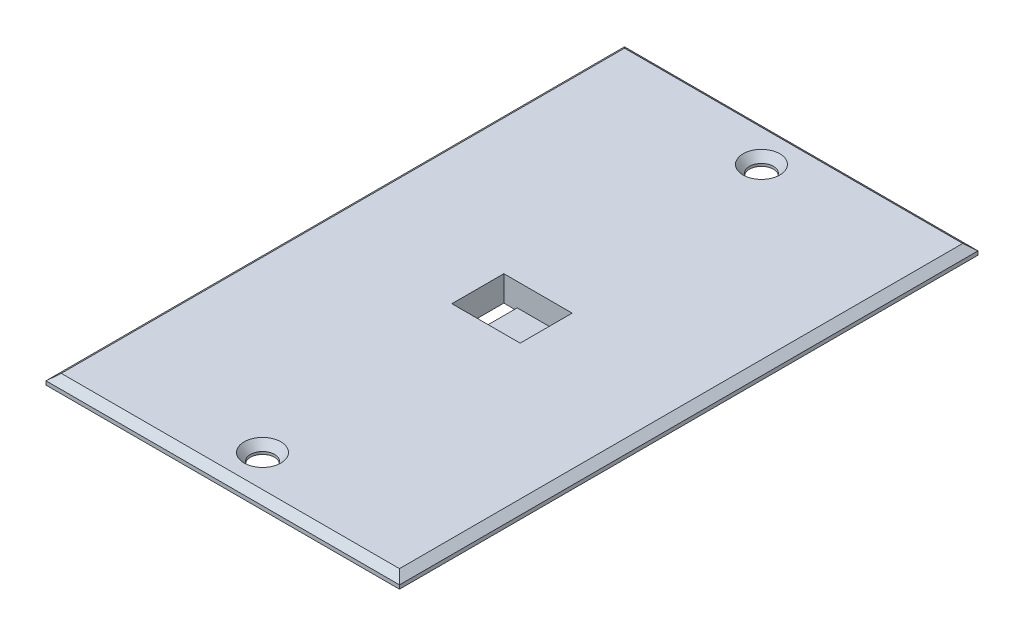
ISO-10303-21;
HEADER;
FILE_DESCRIPTION(('STEP AP214'),'2;1');
FILE_NAME('part.step','',(''),(''),'','','');
FILE_SCHEMA(('AUTOMOTIVE_DESIGN { 1 0 10303 214 1 1 1 1 }'));
ENDSEC;
DATA;
#1=APPLICATION_CONTEXT('core data for automotive mechanical design processes');
#2=APPLICATION_PROTOCOL_DEFINITION('international standard','automotive_design',2000,#1);
#3=PRODUCT_CONTEXT('',#1,'mechanical');
#4=PRODUCT('Part','Part','',(#3));
#5=PRODUCT_RELATED_PRODUCT_CATEGORY('part','',(#4));
#6=PRODUCT_DEFINITION_FORMATION('','',#4);
#7=PRODUCT_DEFINITION_CONTEXT('part definition',#1,'design');
#8=PRODUCT_DEFINITION('design','',#6,#7);
#9=PRODUCT_DEFINITION_SHAPE('','',#8);
#10=(LENGTH_UNIT() NAMED_UNIT(*) SI_UNIT(.MILLI.,.METRE.));
#11=(NAMED_UNIT(*) PLANE_ANGLE_UNIT() SI_UNIT($,.RADIAN.));
#12=(NAMED_UNIT(*) SI_UNIT($,.STERADIAN.) SOLID_ANGLE_UNIT());
#13=UNCERTAINTY_MEASURE_WITH_UNIT(LENGTH_MEASURE(1.E-05),#10,'distance_accuracy_value','');
#14=(GEOMETRIC_REPRESENTATION_CONTEXT(3) GLOBAL_UNCERTAINTY_ASSIGNED_CONTEXT((#13)) GLOBAL_UNIT_ASSIGNED_CONTEXT((#10,
#11,#12)) REPRESENTATION_CONTEXT('',''));
#15=CARTESIAN_POINT('',(0.,0.,0.));
#16=DIRECTION('',(0.,0.,1.));
#17=DIRECTION('',(1.,0.,0.));
#18=AXIS2_PLACEMENT_3D('',#15,#16,#17);
#19=CARTESIAN_POINT('',(6.7,-2.5,-5.1));
#20=DIRECTION('',(1.,0.,0.));
#21=DIRECTION('',(0.,0.,-1.));
#22=AXIS2_PLACEMENT_3D('',#19,#20,#21);
#23=PLANE('',#22);
#24=DIRECTION('',(0.,0.,-1.));
#25=VECTOR('',#24,1.);
#26=CARTESIAN_POINT('',(6.7,2.,-5.1));
#27=LINE('',#26,#25);
#28=CARTESIAN_POINT('',(6.7,2.,5.1));
#29=VERTEX_POINT('',#28);
#30=CARTESIAN_POINT('',(6.7,2.,-5.1));
#31=VERTEX_POINT('',#30);
#32=EDGE_CURVE('E275',#29,#31,#27,.T.);
#33=ORIENTED_EDGE('',*,*,#32,.T.);
#34=DIRECTION('',(0.,1.,0.));
#35=VECTOR('',#34,1.);
#36=CARTESIAN_POINT('',(6.7,-2.5,-5.1));
#37=LINE('',#36,#35);
#38=CARTESIAN_POINT('',(6.7,-2.5,-5.1));
#39=VERTEX_POINT('',#38);
#40=EDGE_CURVE('E302',#39,#31,#37,.T.);
#41=ORIENTED_EDGE('',*,*,#40,.F.);
#42=DIRECTION('',(0.,0.,-1.));
#43=VECTOR('',#42,1.);
#44=CARTESIAN_POINT('',(6.7,-2.5,-5.1));
#45=LINE('',#44,#43);
#46=CARTESIAN_POINT('',(6.7,-2.5,5.1));
#47=VERTEX_POINT('',#46);
#48=EDGE_CURVE('E291',#47,#39,#45,.T.);
#49=ORIENTED_EDGE('',*,*,#48,.F.);
#50=DIRECTION('',(0.,1.,0.));
#51=VECTOR('',#50,1.);
#52=CARTESIAN_POINT('',(6.7,-2.5,5.1));
#53=LINE('',#52,#51);
#54=EDGE_CURVE('E303',#47,#29,#53,.T.);
#55=ORIENTED_EDGE('',*,*,#54,.T.);
#56=EDGE_LOOP('',(#33,#41,#49,#55));
#57=FACE_BOUND('',#56,.T.);
#58=DIRECTION('',(0.,-1.,0.));
#59=VECTOR('',#58,1.);
#60=CARTESIAN_POINT('',(6.7,0.3,-0.637503978051514));
#61=LINE('',#60,#59);
#62=CARTESIAN_POINT('',(6.7,0.96082176619916,-0.637503978051514));
#63=VERTEX_POINT('',#62);
#64=CARTESIAN_POINT('',(6.7,0.299999999999999,-0.637503978051514));
#65=VERTEX_POINT('',#64);
#66=EDGE_CURVE('E225',#63,#65,#61,.T.);
#67=ORIENTED_EDGE('',*,*,#66,.F.);
#68=DIRECTION('',(0.,0.,-1.));
#69=VECTOR('',#68,1.);
#70=CARTESIAN_POINT('',(6.7,0.96082176619916,-0.637503978051514));
#71=LINE('',#70,#69);
#72=CARTESIAN_POINT('',(6.7,0.96082176619916,0.545665972342845));
#73=VERTEX_POINT('',#72);
#74=EDGE_CURVE('E221',#73,#63,#71,.T.);
#75=ORIENTED_EDGE('',*,*,#74,.F.);
#76=DIRECTION('',(0.,1.,0.));
#77=VECTOR('',#76,1.);
#78=CARTESIAN_POINT('',(6.7,0.3,0.545665972342845));
#79=LINE('',#78,#77);
#80=CARTESIAN_POINT('',(6.7,0.3,0.545665972342845));
#81=VERTEX_POINT('',#80);
#82=EDGE_CURVE('E971',#81,#73,#79,.T.);
#83=ORIENTED_EDGE('',*,*,#82,.F.);
#84=DIRECTION('',(0.,0.,1.));
#85=VECTOR('',#84,1.);
#86=CARTESIAN_POINT('',(6.7,0.3,-0.637503978051514));
#87=LINE('',#86,#85);
#88=EDGE_CURVE('E975',#65,#81,#87,.T.);
#89=ORIENTED_EDGE('',*,*,#88,.F.);
#90=EDGE_LOOP('',(#67,#75,#83,#89));
#91=FACE_BOUND('',#90,.T.);
#92=ADVANCED_FACE('F45',(#57,#91),#23,.F.);
#93=CARTESIAN_POINT('',(0.,-2.5,0.));
#94=DIRECTION('',(0.,-1.,0.));
#95=DIRECTION('',(0.,0.,-1.));
#96=AXIS2_PLACEMENT_3D('',#93,#94,#95);
#97=PLANE('',#96);
#98=DIRECTION('',(0.,0.,-1.));
#99=VECTOR('',#98,1.);
#100=CARTESIAN_POINT('',(-4.07864275595177,-2.5,-5.1));
#101=LINE('',#100,#99);
#102=CARTESIAN_POINT('',(-4.07864275595177,-2.5,5.1));
#103=VERTEX_POINT('',#102);
#104=CARTESIAN_POINT('',(-4.07864275595177,-2.5,-5.1));
#105=VERTEX_POINT('',#104);
#106=EDGE_CURVE('E227',#103,#105,#101,.T.);
#107=ORIENTED_EDGE('',*,*,#106,.F.);
#108=DIRECTION('',(1.,0.,0.));
#109=VECTOR('',#108,1.);
#110=CARTESIAN_POINT('',(-6.7,-2.5,5.1));
#111=LINE('',#110,#109);
#112=EDGE_CURVE('E299',#103,#47,#111,.T.);
#113=ORIENTED_EDGE('',*,*,#112,.T.);
#114=ORIENTED_EDGE('',*,*,#48,.T.);
#115=DIRECTION('',(-1.,0.,0.));
#116=VECTOR('',#115,1.);
#117=CARTESIAN_POINT('',(-6.7,-2.5,-5.1));
#118=LINE('',#117,#116);
#119=EDGE_CURVE('E295',#39,#105,#118,.T.);
#120=ORIENTED_EDGE('',*,*,#119,.T.);
#121=EDGE_LOOP('',(#107,#113,#114,#120));
#122=FACE_BOUND('',#121,.T.);
#123=ADVANCED_FACE('F567',(#122),#97,.F.);
#124=CARTESIAN_POINT('',(-34.675,2.,56.75));
#125=DIRECTION('',(0.,0.,-1.));
#126=DIRECTION('',(-1.,0.,0.));
#127=AXIS2_PLACEMENT_3D('',#124,#125,#126);
#128=PLANE('',#127);
#129=DIRECTION('',(0.,-1.,0.));
#130=VECTOR('',#129,1.);
#131=CARTESIAN_POINT('',(34.675,2.,56.75));
#132=LINE('',#131,#130);
#133=CARTESIAN_POINT('',(34.675,0.741350553234083,56.75));
#134=VERTEX_POINT('',#133);
#135=CARTESIAN_POINT('',(34.675,0.,56.75));
#136=VERTEX_POINT('',#135);
#137=EDGE_CURVE('E401',#134,#136,#132,.T.);
#138=ORIENTED_EDGE('',*,*,#137,.F.);
#139=DIRECTION('',(-1.,0.,0.));
#140=VECTOR('',#139,1.);
#141=CARTESIAN_POINT('',(-34.675,0.741350553234083,56.75));
#142=LINE('',#141,#140);
#143=CARTESIAN_POINT('',(-34.675,0.741350553234083,56.75));
#144=VERTEX_POINT('',#143);
#145=EDGE_CURVE('E448',#134,#144,#142,.T.);
#146=ORIENTED_EDGE('',*,*,#145,.T.);
#147=DIRECTION('',(0.,-1.,0.));
#148=VECTOR('',#147,1.);
#149=CARTESIAN_POINT('',(-34.675,2.,56.75));
#150=LINE('',#149,#148);
#151=CARTESIAN_POINT('',(-34.675,0.,56.75));
#152=VERTEX_POINT('',#151);
#153=EDGE_CURVE('E392',#144,#152,#150,.T.);
#154=ORIENTED_EDGE('',*,*,#153,.T.);
#155=DIRECTION('',(1.,0.,0.));
#156=VECTOR('',#155,1.);
#157=CARTESIAN_POINT('',(-34.675,0.,56.75));
#158=LINE('',#157,#156);
#159=EDGE_CURVE('E375',#152,#136,#158,.T.);
#160=ORIENTED_EDGE('',*,*,#159,.T.);
#161=EDGE_LOOP('',(#138,#146,#154,#160));
#162=FACE_BOUND('',#161,.T.);
#163=ADVANCED_FACE('F533',(#162),#128,.F.);
#164=CARTESIAN_POINT('',(34.675,2.,-56.75));
#165=DIRECTION('',(1.,0.,0.));
#166=DIRECTION('',(0.,0.,-1.));
#167=AXIS2_PLACEMENT_3D('',#164,#165,#166);
#168=PLANE('',#167);
#169=DIRECTION('',(0.,-1.,0.));
#170=VECTOR('',#169,1.);
#171=CARTESIAN_POINT('',(34.675,2.,-56.75));
#172=LINE('',#171,#170);
#173=CARTESIAN_POINT('',(34.675,0.741350553234083,-56.75));
#174=VERTEX_POINT('',#173);
#175=CARTESIAN_POINT('',(34.675,0.,-56.75));
#176=VERTEX_POINT('',#175);
#177=EDGE_CURVE('E398',#174,#176,#172,.T.);
#178=ORIENTED_EDGE('',*,*,#177,.F.);
#179=DIRECTION('',(0.,0.,1.));
#180=VECTOR('',#179,1.);
#181=CARTESIAN_POINT('',(34.675,0.741350553234083,56.75));
#182=LINE('',#181,#180);
#183=EDGE_CURVE('E445',#174,#134,#182,.T.);
#184=ORIENTED_EDGE('',*,*,#183,.T.);
#185=ORIENTED_EDGE('',*,*,#137,.T.);
#186=DIRECTION('',(0.,0.,1.));
#187=VECTOR('',#186,1.);
#188=CARTESIAN_POINT('',(34.675,0.,-56.75));
#189=LINE('',#188,#187);
#190=EDGE_CURVE('E379',#176,#136,#189,.T.);
#191=ORIENTED_EDGE('',*,*,#190,.F.);
#192=EDGE_LOOP('',(#178,#184,#185,#191));
#193=FACE_BOUND('',#192,.T.);
#194=ADVANCED_FACE('F559',(#193),#168,.T.);
#195=CARTESIAN_POINT('',(-34.675,2.,-56.75));
#196=DIRECTION('',(0.,0.,-1.));
#197=DIRECTION('',(-1.,0.,0.));
#198=AXIS2_PLACEMENT_3D('',#195,#196,#197);
#199=PLANE('',#198);
#200=DIRECTION('',(0.,-1.,0.));
#201=VECTOR('',#200,1.);
#202=CARTESIAN_POINT('',(-34.675,2.,-56.75));
#203=LINE('',#202,#201);
#204=CARTESIAN_POINT('',(-34.675,0.741350553234083,-56.75));
#205=VERTEX_POINT('',#204);
#206=CARTESIAN_POINT('',(-34.675,0.,-56.75));
#207=VERTEX_POINT('',#206);
#208=EDGE_CURVE('E395',#205,#207,#203,.T.);
#209=ORIENTED_EDGE('',*,*,#208,.F.);
#210=DIRECTION('',(1.,0.,0.));
#211=VECTOR('',#210,1.);
#212=CARTESIAN_POINT('',(34.675,0.741350553234083,-56.75));
#213=LINE('',#212,#211);
#214=EDGE_CURVE('E441',#205,#174,#213,.T.);
#215=ORIENTED_EDGE('',*,*,#214,.T.);
#216=ORIENTED_EDGE('',*,*,#177,.T.);
#217=DIRECTION('',(1.,0.,0.));
#218=VECTOR('',#217,1.);
#219=CARTESIAN_POINT('',(-34.675,0.,-56.75));
#220=LINE('',#219,#218);
#221=EDGE_CURVE('E384',#207,#176,#220,.T.);
#222=ORIENTED_EDGE('',*,*,#221,.F.);
#223=EDGE_LOOP('',(#209,#215,#216,#222));
#224=FACE_BOUND('',#223,.T.);
#225=ADVANCED_FACE('F543',(#224),#199,.T.);
#226=CARTESIAN_POINT('',(-34.675,2.,-56.75));
#227=DIRECTION('',(1.,0.,0.));
#228=DIRECTION('',(0.,0.,-1.));
#229=AXIS2_PLACEMENT_3D('',#226,#227,#228);
#230=PLANE('',#229);
#231=ORIENTED_EDGE('',*,*,#153,.F.);
#232=DIRECTION('',(0.,0.,-1.));
#233=VECTOR('',#232,1.);
#234=CARTESIAN_POINT('',(-34.675,0.741350553234083,-56.75));
#235=LINE('',#234,#233);
#236=EDGE_CURVE('E451',#144,#205,#235,.T.);
#237=ORIENTED_EDGE('',*,*,#236,.T.);
#238=ORIENTED_EDGE('',*,*,#208,.T.);
#239=DIRECTION('',(0.,0.,1.));
#240=VECTOR('',#239,1.);
#241=CARTESIAN_POINT('',(-34.675,0.,-56.75));
#242=LINE('',#241,#240);
#243=EDGE_CURVE('E388',#207,#152,#242,.T.);
#244=ORIENTED_EDGE('',*,*,#243,.T.);
#245=EDGE_LOOP('',(#231,#237,#238,#244));
#246=FACE_BOUND('',#245,.T.);
#247=ADVANCED_FACE('F538',(#246),#230,.F.);
#248=CARTESIAN_POINT('',(0.,2.,0.));
#249=DIRECTION('',(0.,-1.,0.));
#250=DIRECTION('',(0.,0.,-1.));
#251=AXIS2_PLACEMENT_3D('',#248,#249,#250);
#252=PLANE('',#251);
#253=DIRECTION('',(-1.,0.,0.));
#254=VECTOR('',#253,1.);
#255=CARTESIAN_POINT('',(-6.7,2.,-5.1));
#256=LINE('',#255,#254);
#257=CARTESIAN_POINT('',(-6.7,2.,-5.1));
#258=VERTEX_POINT('',#257);
#259=EDGE_CURVE('E279',#31,#258,#256,.T.);
#260=ORIENTED_EDGE('',*,*,#259,.F.);
#261=ORIENTED_EDGE('',*,*,#32,.F.);
#262=DIRECTION('',(1.,0.,0.));
#263=VECTOR('',#262,1.);
#264=CARTESIAN_POINT('',(-6.7,2.,5.1));
#265=LINE('',#264,#263);
#266=CARTESIAN_POINT('',(-6.7,2.,5.1));
#267=VERTEX_POINT('',#266);
#268=EDGE_CURVE('E287',#267,#29,#265,.T.);
#269=ORIENTED_EDGE('',*,*,#268,.F.);
#270=DIRECTION('',(0.,0.,1.));
#271=VECTOR('',#270,1.);
#272=CARTESIAN_POINT('',(-6.7,2.,-5.1));
#273=LINE('',#272,#271);
#274=EDGE_CURVE('E283',#258,#267,#273,.T.);
#275=ORIENTED_EDGE('',*,*,#274,.F.);
#276=EDGE_LOOP('',(#260,#261,#269,#275));
#277=FACE_BOUND('',#276,.T.);
#278=CARTESIAN_POINT('',(0.,2.,48.9430790589483));
#279=DIRECTION('',(0.,-1.,0.));
#280=DIRECTION('',(0.,0.,-1.));
#281=AXIS2_PLACEMENT_3D('',#278,#279,#280);
#282=CIRCLE('',#281,3.60864944676592);
#283=CARTESIAN_POINT('',(0.,2.,45.3344296121823));
#284=VERTEX_POINT('',#283);
#285=EDGE_CURVE('E433',#284,#284,#282,.T.);
#286=ORIENTED_EDGE('',*,*,#285,.T.);
#287=EDGE_LOOP('',(#286));
#288=FACE_BOUND('',#287,.T.);
#289=CARTESIAN_POINT('',(0.,2.,-48.9430790589483));
#290=DIRECTION('',(0.,-1.,0.));
#291=DIRECTION('',(0.,0.,-1.));
#292=AXIS2_PLACEMENT_3D('',#289,#290,#291);
#293=CIRCLE('',#292,3.60864944676592);
#294=CARTESIAN_POINT('',(0.,2.,-52.5517285057142));
#295=VERTEX_POINT('',#294);
#296=EDGE_CURVE('E429',#295,#295,#293,.T.);
#297=ORIENTED_EDGE('',*,*,#296,.T.);
#298=EDGE_LOOP('',(#297));
#299=FACE_BOUND('',#298,.T.);
#300=DIRECTION('',(0.,0.,-1.));
#301=VECTOR('',#300,1.);
#302=CARTESIAN_POINT('',(33.175,2.,-56.75));
#303=LINE('',#302,#301);
#304=CARTESIAN_POINT('',(33.175,2.,55.25));
#305=VERTEX_POINT('',#304);
#306=CARTESIAN_POINT('',(33.175,2.,-55.25));
#307=VERTEX_POINT('',#306);
#308=EDGE_CURVE('E422',#305,#307,#303,.T.);
#309=ORIENTED_EDGE('',*,*,#308,.T.);
#310=DIRECTION('',(-1.,0.,0.));
#311=VECTOR('',#310,1.);
#312=CARTESIAN_POINT('',(-34.675,2.,-55.25));
#313=LINE('',#312,#311);
#314=CARTESIAN_POINT('',(-33.175,2.,-55.25));
#315=VERTEX_POINT('',#314);
#316=EDGE_CURVE('E425',#307,#315,#313,.T.);
#317=ORIENTED_EDGE('',*,*,#316,.T.);
#318=DIRECTION('',(0.,0.,1.));
#319=VECTOR('',#318,1.);
#320=CARTESIAN_POINT('',(-33.175,2.,0.));
#321=LINE('',#320,#319);
#322=CARTESIAN_POINT('',(-33.175,2.,55.25));
#323=VERTEX_POINT('',#322);
#324=EDGE_CURVE('E416',#315,#323,#321,.T.);
#325=ORIENTED_EDGE('',*,*,#324,.T.);
#326=DIRECTION('',(1.,0.,0.));
#327=VECTOR('',#326,1.);
#328=CARTESIAN_POINT('',(0.,2.,55.25));
#329=LINE('',#328,#327);
#330=EDGE_CURVE('E419',#323,#305,#329,.T.);
#331=ORIENTED_EDGE('',*,*,#330,.T.);
#332=EDGE_LOOP('',(#309,#317,#325,#331));
#333=FACE_BOUND('',#332,.T.);
#334=ADVANCED_FACE('F521',(#277,#288,#299,#333),#252,.F.);
#335=CARTESIAN_POINT('',(0.,0.,0.));
#336=DIRECTION('',(0.,-1.,0.));
#337=DIRECTION('',(0.,0.,-1.));
#338=AXIS2_PLACEMENT_3D('',#335,#336,#337);
#339=PLANE('',#338);
#340=DIRECTION('',(0.,0.,-1.));
#341=VECTOR('',#340,1.);
#342=CARTESIAN_POINT('',(-30.1192080439515,0.,-45.2572475035417));
#343=LINE('',#342,#341);
#344=CARTESIAN_POINT('',(-30.1192080439515,0.,45.2572475035417));
#345=VERTEX_POINT('',#344);
#346=CARTESIAN_POINT('',(-30.1192080439515,0.,-45.2572475035417));
#347=VERTEX_POINT('',#346);
#348=EDGE_CURVE('E319',#345,#347,#343,.T.);
#349=ORIENTED_EDGE('',*,*,#348,.F.);
#350=DIRECTION('',(-1.,0.,0.));
#351=VECTOR('',#350,1.);
#352=CARTESIAN_POINT('',(30.1192080439515,0.,45.2572475035417));
#353=LINE('',#352,#351);
#354=CARTESIAN_POINT('',(30.1192080439515,0.,45.2572475035417));
#355=VERTEX_POINT('',#354);
#356=EDGE_CURVE('E336',#355,#345,#353,.T.);
#357=ORIENTED_EDGE('',*,*,#356,.F.);
#358=DIRECTION('',(0.,0.,1.));
#359=VECTOR('',#358,1.);
#360=CARTESIAN_POINT('',(30.1192080439515,0.,-45.2572475035417));
#361=LINE('',#360,#359);
#362=CARTESIAN_POINT('',(30.1192080439515,0.,-45.2572475035417));
#363=VERTEX_POINT('',#362);
#364=EDGE_CURVE('E355',#363,#355,#361,.T.);
#365=ORIENTED_EDGE('',*,*,#364,.F.);
#366=DIRECTION('',(1.,0.,0.));
#367=VECTOR('',#366,1.);
#368=CARTESIAN_POINT('',(30.1192080439515,0.,-45.2572475035417));
#369=LINE('',#368,#367);
#370=EDGE_CURVE('E351',#347,#363,#369,.T.);
#371=ORIENTED_EDGE('',*,*,#370,.F.);
#372=EDGE_LOOP('',(#349,#357,#365,#371));
#373=FACE_BOUND('',#372,.T.);
#374=CARTESIAN_POINT('',(0.,0.,-48.9430790589483));
#375=DIRECTION('',(0.,-1.,0.));
#376=DIRECTION('',(0.,0.,-1.));
#377=AXIS2_PLACEMENT_3D('',#374,#375,#376);
#378=CIRCLE('',#377,2.35);
#379=CARTESIAN_POINT('',(0.,0.,-51.2930790589483));
#380=VERTEX_POINT('',#379);
#381=EDGE_CURVE('E380',#380,#380,#378,.T.);
#382=ORIENTED_EDGE('',*,*,#381,.F.);
#383=EDGE_LOOP('',(#382));
#384=FACE_BOUND('',#383,.T.);
#385=CARTESIAN_POINT('',(0.,0.,48.9430790589483));
#386=DIRECTION('',(0.,-1.,0.));
#387=DIRECTION('',(0.,0.,-1.));
#388=AXIS2_PLACEMENT_3D('',#385,#386,#387);
#389=CIRCLE('',#388,2.35);
#390=CARTESIAN_POINT('',(0.,0.,46.5930790589483));
#391=VERTEX_POINT('',#390);
#392=EDGE_CURVE('E405',#391,#391,#389,.T.);
#393=ORIENTED_EDGE('',*,*,#392,.F.);
#394=EDGE_LOOP('',(#393));
#395=FACE_BOUND('',#394,.T.);
#396=ORIENTED_EDGE('',*,*,#159,.F.);
#397=ORIENTED_EDGE('',*,*,#243,.F.);
#398=ORIENTED_EDGE('',*,*,#221,.T.);
#399=ORIENTED_EDGE('',*,*,#190,.T.);
#400=EDGE_LOOP('',(#396,#397,#398,#399));
#401=FACE_BOUND('',#400,.T.);
#402=ADVANCED_FACE('F517',(#373,#384,#395,#401),#339,.T.);
#403=CARTESIAN_POINT('',(0.,-0.5,48.9430790589483));
#404=DIRECTION('',(0.,1.,0.));
#405=DIRECTION('',(0.,0.,1.));
#406=AXIS2_PLACEMENT_3D('',#403,#404,#405);
#407=CYLINDRICAL_SURFACE('',#406,2.35);
#408=CARTESIAN_POINT('',(0.,0.499999999999986,48.9430790589483));
#409=DIRECTION('',(0.,-1.,0.));
#410=DIRECTION('',(0.,0.,-1.));
#411=AXIS2_PLACEMENT_3D('',#408,#409,#410);
#412=CIRCLE('',#411,2.35);
#413=CARTESIAN_POINT('',(0.,0.499999999999986,46.5930790589483));
#414=VERTEX_POINT('',#413);
#415=EDGE_CURVE('E404',#414,#414,#412,.F.);
#416=ORIENTED_EDGE('',*,*,#415,.T.);
#417=EDGE_LOOP('',(#416));
#418=FACE_BOUND('',#417,.T.);
#419=ORIENTED_EDGE('',*,*,#392,.T.);
#420=EDGE_LOOP('',(#419));
#421=FACE_BOUND('',#420,.T.);
#422=ADVANCED_FACE('F520',(#418,#421),#407,.F.);
#423=CARTESIAN_POINT('',(0.,-0.5,-48.9430790589483));
#424=DIRECTION('',(0.,1.,0.));
#425=DIRECTION('',(0.,0.,1.));
#426=AXIS2_PLACEMENT_3D('',#423,#424,#425);
#427=CYLINDRICAL_SURFACE('',#426,2.35);
#428=CARTESIAN_POINT('',(0.,0.499999999999986,-48.9430790589483));
#429=DIRECTION('',(0.,-1.,0.));
#430=DIRECTION('',(0.,0.,-1.));
#431=AXIS2_PLACEMENT_3D('',#428,#429,#430);
#432=CIRCLE('',#431,2.35);
#433=CARTESIAN_POINT('',(0.,0.499999999999986,-51.2930790589483));
#434=VERTEX_POINT('',#433);
#435=EDGE_CURVE('E437',#434,#434,#432,.F.);
#436=ORIENTED_EDGE('',*,*,#435,.T.);
#437=EDGE_LOOP('',(#436));
#438=FACE_BOUND('',#437,.T.);
#439=ORIENTED_EDGE('',*,*,#381,.T.);
#440=EDGE_LOOP('',(#439));
#441=FACE_BOUND('',#440,.T.);
#442=ADVANCED_FACE('F599',(#438,#441),#427,.F.);
#443=CARTESIAN_POINT('',(0.,0.499999999999986,48.9430790589483));
#444=DIRECTION('',(0.,1.,0.));
#445=DIRECTION('',(0.,0.,1.));
#446=AXIS2_PLACEMENT_3D('',#443,#444,#445);
#447=CONICAL_SURFACE('',#446,2.35,0.698131700797728);
#448=ORIENTED_EDGE('',*,*,#285,.F.);
#449=EDGE_LOOP('',(#448));
#450=FACE_BOUND('',#449,.T.);
#451=ORIENTED_EDGE('',*,*,#415,.F.);
#452=EDGE_LOOP('',(#451));
#453=FACE_BOUND('',#452,.T.);
#454=ADVANCED_FACE('F602',(#450,#453),#447,.F.);
#455=CARTESIAN_POINT('',(0.,0.499999999999986,-48.9430790589483));
#456=DIRECTION('',(0.,1.,0.));
#457=DIRECTION('',(0.,0.,1.));
#458=AXIS2_PLACEMENT_3D('',#455,#456,#457);
#459=CONICAL_SURFACE('',#458,2.35,0.698131700797728);
#460=ORIENTED_EDGE('',*,*,#296,.F.);
#461=EDGE_LOOP('',(#460));
#462=FACE_BOUND('',#461,.T.);
#463=ORIENTED_EDGE('',*,*,#435,.F.);
#464=EDGE_LOOP('',(#463));
#465=FACE_BOUND('',#464,.T.);
#466=ADVANCED_FACE('F641',(#462,#465),#459,.F.);
#467=CARTESIAN_POINT('',(0.,2.,55.25));
#468=DIRECTION('',(0.,-0.766044443118979,-0.642787609686538));
#469=DIRECTION('',(1.,0.,0.));
#470=AXIS2_PLACEMENT_3D('',#467,#468,#469);
#471=PLANE('',#470);
#472=DIRECTION('',(0.608120402411343,-0.510273605374736,0.608120402411343));
#473=VECTOR('',#472,1.);
#474=CARTESIAN_POINT('',(20.9065391894751,12.2944609412243,42.9815391894751));
#475=LINE('',#474,#473);
#476=EDGE_CURVE('E460',#305,#134,#475,.T.);
#477=ORIENTED_EDGE('',*,*,#476,.F.);
#478=ORIENTED_EDGE('',*,*,#330,.F.);
#479=DIRECTION('',(0.608120402411343,0.510273605374736,-0.608120402411344));
#480=VECTOR('',#479,1.);
#481=CARTESIAN_POINT('',(-12.7429740834514,19.1445054107805,34.8179740834514));
#482=LINE('',#481,#480);
#483=EDGE_CURVE('E409',#144,#323,#482,.T.);
#484=ORIENTED_EDGE('',*,*,#483,.F.);
#485=ORIENTED_EDGE('',*,*,#145,.F.);
#486=EDGE_LOOP('',(#477,#478,#484,#485));
#487=FACE_BOUND('',#486,.T.);
#488=ADVANCED_FACE('F649',(#487),#471,.F.);
#489=CARTESIAN_POINT('',(-33.175,2.,0.));
#490=DIRECTION('',(0.642787609686538,-0.766044443118979,0.));
#491=DIRECTION('',(0.,0.,1.));
#492=AXIS2_PLACEMENT_3D('',#489,#490,#491);
#493=PLANE('',#492);
#494=ORIENTED_EDGE('',*,*,#483,.T.);
#495=ORIENTED_EDGE('',*,*,#324,.F.);
#496=DIRECTION('',(0.608120402411343,0.510273605374736,0.608120402411343));
#497=VECTOR('',#496,1.);
#498=CARTESIAN_POINT('',(-12.7429740834514,19.1445054107805,-34.8179740834514));
#499=LINE('',#498,#497);
#500=EDGE_CURVE('E457',#205,#315,#499,.T.);
#501=ORIENTED_EDGE('',*,*,#500,.F.);
#502=ORIENTED_EDGE('',*,*,#236,.F.);
#503=EDGE_LOOP('',(#494,#495,#501,#502));
#504=FACE_BOUND('',#503,.T.);
#505=ADVANCED_FACE('F548',(#504),#493,.F.);
#506=CARTESIAN_POINT('',(34.675,0.741350553234083,-56.75));
#507=DIRECTION('',(0.642787609686538,0.766044443118979,0.));
#508=DIRECTION('',(0.,0.,-1.));
#509=AXIS2_PLACEMENT_3D('',#506,#507,#508);
#510=PLANE('',#509);
#511=ORIENTED_EDGE('',*,*,#476,.T.);
#512=ORIENTED_EDGE('',*,*,#183,.F.);
#513=DIRECTION('',(-0.608120402411343,0.510273605374736,0.608120402411344));
#514=VECTOR('',#513,1.);
#515=CARTESIAN_POINT('',(34.675,0.741350553234083,-56.75));
#516=LINE('',#515,#514);
#517=EDGE_CURVE('E365',#307,#174,#516,.F.);
#518=ORIENTED_EDGE('',*,*,#517,.F.);
#519=ORIENTED_EDGE('',*,*,#308,.F.);
#520=EDGE_LOOP('',(#511,#512,#518,#519));
#521=FACE_BOUND('',#520,.T.);
#522=ADVANCED_FACE('F556',(#521),#510,.T.);
#523=CARTESIAN_POINT('',(-34.675,0.741350553234083,-56.75));
#524=DIRECTION('',(0.,0.766044443118979,-0.642787609686538));
#525=DIRECTION('',(-1.,0.,0.));
#526=AXIS2_PLACEMENT_3D('',#523,#524,#525);
#527=PLANE('',#526);
#528=ORIENTED_EDGE('',*,*,#500,.T.);
#529=ORIENTED_EDGE('',*,*,#316,.F.);
#530=ORIENTED_EDGE('',*,*,#517,.T.);
#531=ORIENTED_EDGE('',*,*,#214,.F.);
#532=EDGE_LOOP('',(#528,#529,#530,#531));
#533=FACE_BOUND('',#532,.T.);
#534=ADVANCED_FACE('F551',(#533),#527,.T.);
#535=CARTESIAN_POINT('',(-30.1192080439515,1.5,-45.2572475035417));
#536=DIRECTION('',(-1.,0.,0.));
#537=DIRECTION('',(0.,0.,1.));
#538=AXIS2_PLACEMENT_3D('',#535,#536,#537);
#539=PLANE('',#538);
#540=ORIENTED_EDGE('',*,*,#348,.T.);
#541=DIRECTION('',(0.,-1.,0.));
#542=VECTOR('',#541,1.);
#543=CARTESIAN_POINT('',(-30.1192080439515,1.5,-45.2572475035417));
#544=LINE('',#543,#542);
#545=CARTESIAN_POINT('',(-30.1192080439515,1.5,-45.2572475035417));
#546=VERTEX_POINT('',#545);
#547=EDGE_CURVE('E348',#546,#347,#544,.T.);
#548=ORIENTED_EDGE('',*,*,#547,.F.);
#549=DIRECTION('',(0.,0.,-1.));
#550=VECTOR('',#549,1.);
#551=CARTESIAN_POINT('',(-30.1192080439515,1.5,-45.2572475035417));
#552=LINE('',#551,#550);
#553=CARTESIAN_POINT('',(-30.1192080439515,1.5,45.2572475035417));
#554=VERTEX_POINT('',#553);
#555=EDGE_CURVE('E331',#554,#546,#552,.T.);
#556=ORIENTED_EDGE('',*,*,#555,.F.);
#557=DIRECTION('',(0.,-1.,0.));
#558=VECTOR('',#557,1.);
#559=CARTESIAN_POINT('',(-30.1192080439515,1.5,45.2572475035417));
#560=LINE('',#559,#558);
#561=EDGE_CURVE('E362',#554,#345,#560,.T.);
#562=ORIENTED_EDGE('',*,*,#561,.T.);
#563=EDGE_LOOP('',(#540,#548,#556,#562));
#564=FACE_BOUND('',#563,.T.);
#565=ADVANCED_FACE('F505',(#564),#539,.F.);
#566=CARTESIAN_POINT('',(30.1192080439515,1.5,45.2572475035417));
#567=DIRECTION('',(0.,0.,1.));
#568=DIRECTION('',(1.,0.,0.));
#569=AXIS2_PLACEMENT_3D('',#566,#567,#568);
#570=PLANE('',#569);
#571=ORIENTED_EDGE('',*,*,#356,.T.);
#572=ORIENTED_EDGE('',*,*,#561,.F.);
#573=DIRECTION('',(-1.,0.,0.));
#574=VECTOR('',#573,1.);
#575=CARTESIAN_POINT('',(30.1192080439515,1.5,45.2572475035417));
#576=LINE('',#575,#574);
#577=CARTESIAN_POINT('',(30.1192080439515,1.5,45.2572475035417));
#578=VERTEX_POINT('',#577);
#579=EDGE_CURVE('E344',#578,#554,#576,.T.);
#580=ORIENTED_EDGE('',*,*,#579,.F.);
#581=DIRECTION('',(0.,-1.,0.));
#582=VECTOR('',#581,1.);
#583=CARTESIAN_POINT('',(30.1192080439515,1.5,45.2572475035417));
#584=LINE('',#583,#582);
#585=EDGE_CURVE('E366',#578,#355,#584,.T.);
#586=ORIENTED_EDGE('',*,*,#585,.T.);
#587=EDGE_LOOP('',(#571,#572,#580,#586));
#588=FACE_BOUND('',#587,.T.);
#589=ADVANCED_FACE('F514',(#588),#570,.F.);
#590=CARTESIAN_POINT('',(30.1192080439515,1.5,-45.2572475035417));
#591=DIRECTION('',(1.,0.,0.));
#592=DIRECTION('',(0.,0.,-1.));
#593=AXIS2_PLACEMENT_3D('',#590,#591,#592);
#594=PLANE('',#593);
#595=ORIENTED_EDGE('',*,*,#364,.T.);
#596=ORIENTED_EDGE('',*,*,#585,.F.);
#597=DIRECTION('',(0.,0.,1.));
#598=VECTOR('',#597,1.);
#599=CARTESIAN_POINT('',(30.1192080439515,1.5,-45.2572475035417));
#600=LINE('',#599,#598);
#601=CARTESIAN_POINT('',(30.1192080439515,1.5,-45.2572475035417));
#602=VERTEX_POINT('',#601);
#603=EDGE_CURVE('E340',#602,#578,#600,.T.);
#604=ORIENTED_EDGE('',*,*,#603,.F.);
#605=DIRECTION('',(0.,-1.,0.));
#606=VECTOR('',#605,1.);
#607=CARTESIAN_POINT('',(30.1192080439515,1.5,-45.2572475035417));
#608=LINE('',#607,#606);
#609=EDGE_CURVE('E369',#602,#363,#608,.T.);
#610=ORIENTED_EDGE('',*,*,#609,.T.);
#611=EDGE_LOOP('',(#595,#596,#604,#610));
#612=FACE_BOUND('',#611,.T.);
#613=ADVANCED_FACE('F512',(#612),#594,.F.);
#614=CARTESIAN_POINT('',(30.1192080439515,1.5,-45.2572475035417));
#615=DIRECTION('',(0.,0.,-1.));
#616=DIRECTION('',(-1.,0.,0.));
#617=AXIS2_PLACEMENT_3D('',#614,#615,#616);
#618=PLANE('',#617);
#619=ORIENTED_EDGE('',*,*,#370,.T.);
#620=ORIENTED_EDGE('',*,*,#609,.F.);
#621=DIRECTION('',(1.,0.,0.));
#622=VECTOR('',#621,1.);
#623=CARTESIAN_POINT('',(30.1192080439515,1.5,-45.2572475035417));
#624=LINE('',#623,#622);
#625=EDGE_CURVE('E335',#546,#602,#624,.T.);
#626=ORIENTED_EDGE('',*,*,#625,.F.);
#627=ORIENTED_EDGE('',*,*,#547,.T.);
#628=EDGE_LOOP('',(#619,#620,#626,#627));
#629=FACE_BOUND('',#628,.T.);
#630=ADVANCED_FACE('F499',(#629),#618,.F.);
#631=CARTESIAN_POINT('',(0.,1.5,0.));
#632=DIRECTION('',(0.,-1.,0.));
#633=DIRECTION('',(0.,0.,-1.));
#634=AXIS2_PLACEMENT_3D('',#631,#632,#633);
#635=PLANE('',#634);
#636=DIRECTION('',(0.,0.,-1.));
#637=VECTOR('',#636,1.);
#638=CARTESIAN_POINT('',(-10.4666275698357,1.5,0.));
#639=LINE('',#638,#637);
#640=CARTESIAN_POINT('',(-10.4666275698357,1.5,8.54946269997599));
#641=VERTEX_POINT('',#640);
#642=CARTESIAN_POINT('',(-10.4666275698357,1.5,-8.54946269997599));
#643=VERTEX_POINT('',#642);
#644=EDGE_CURVE('E208',#641,#643,#639,.T.);
#645=ORIENTED_EDGE('',*,*,#644,.F.);
#646=DIRECTION('',(-1.,0.,0.));
#647=VECTOR('',#646,1.);
#648=CARTESIAN_POINT('',(0.,1.5,8.54946269997599));
#649=LINE('',#648,#647);
#650=CARTESIAN_POINT('',(10.4666275698356,1.5,8.54946269997599));
#651=VERTEX_POINT('',#650);
#652=EDGE_CURVE('E454',#651,#641,#649,.T.);
#653=ORIENTED_EDGE('',*,*,#652,.F.);
#654=DIRECTION('',(0.,0.,1.));
#655=VECTOR('',#654,1.);
#656=CARTESIAN_POINT('',(10.4666275698356,1.5,0.));
#657=LINE('',#656,#655);
#658=CARTESIAN_POINT('',(10.4666275698356,1.5,-8.54946269997599));
#659=VERTEX_POINT('',#658);
#660=EDGE_CURVE('E470',#659,#651,#657,.T.);
#661=ORIENTED_EDGE('',*,*,#660,.F.);
#662=DIRECTION('',(1.,0.,0.));
#663=VECTOR('',#662,1.);
#664=CARTESIAN_POINT('',(0.,1.5,-8.54946269997599));
#665=LINE('',#664,#663);
#666=EDGE_CURVE('E474',#643,#659,#665,.T.);
#667=ORIENTED_EDGE('',*,*,#666,.F.);
#668=EDGE_LOOP('',(#645,#653,#661,#667));
#669=FACE_BOUND('',#668,.T.);
#670=ORIENTED_EDGE('',*,*,#555,.T.);
#671=ORIENTED_EDGE('',*,*,#625,.T.);
#672=ORIENTED_EDGE('',*,*,#603,.T.);
#673=ORIENTED_EDGE('',*,*,#579,.T.);
#674=EDGE_LOOP('',(#670,#671,#672,#673));
#675=FACE_BOUND('',#674,.T.);
#676=ADVANCED_FACE('F496',(#669,#675),#635,.T.);
#677=CARTESIAN_POINT('',(-10.4666275698357,-2.5,-8.54946269997599));
#678=DIRECTION('',(-1.,0.,0.));
#679=DIRECTION('',(0.,0.,1.));
#680=AXIS2_PLACEMENT_3D('',#677,#678,#679);
#681=PLANE('',#680);
#682=DIRECTION('',(0.,1.,0.));
#683=VECTOR('',#682,1.);
#684=CARTESIAN_POINT('',(-10.4666275698357,-2.5,8.54946269997599));
#685=LINE('',#684,#683);
#686=CARTESIAN_POINT('',(-10.4666275698356,-3.,8.54946269997599));
#687=VERTEX_POINT('',#686);
#688=EDGE_CURVE('E306',#687,#641,#685,.T.);
#689=ORIENTED_EDGE('',*,*,#688,.T.);
#690=ORIENTED_EDGE('',*,*,#644,.T.);
#691=DIRECTION('',(0.,1.,0.));
#692=VECTOR('',#691,1.);
#693=CARTESIAN_POINT('',(-10.4666275698357,-2.5,-8.54946269997599));
#694=LINE('',#693,#692);
#695=CARTESIAN_POINT('',(-10.4666275698356,-3.,-8.54946269997599));
#696=VERTEX_POINT('',#695);
#697=EDGE_CURVE('E315',#696,#643,#694,.T.);
#698=ORIENTED_EDGE('',*,*,#697,.F.);
#699=DIRECTION('',(0.,0.,-1.));
#700=VECTOR('',#699,1.);
#701=CARTESIAN_POINT('',(-10.4666275698356,-3.,8.54946269997599));
#702=LINE('',#701,#700);
#703=EDGE_CURVE('E267',#687,#696,#702,.T.);
#704=ORIENTED_EDGE('',*,*,#703,.F.);
#705=EDGE_LOOP('',(#689,#690,#698,#704));
#706=FACE_BOUND('',#705,.T.);
#707=ADVANCED_FACE('F482',(#706),#681,.T.);
#708=CARTESIAN_POINT('',(10.4666275698356,-2.5,-8.54946269997599));
#709=DIRECTION('',(0.,0.,-1.));
#710=DIRECTION('',(-1.,0.,0.));
#711=AXIS2_PLACEMENT_3D('',#708,#709,#710);
#712=PLANE('',#711);
#713=ORIENTED_EDGE('',*,*,#697,.T.);
#714=ORIENTED_EDGE('',*,*,#666,.T.);
#715=DIRECTION('',(0.,1.,0.));
#716=VECTOR('',#715,1.);
#717=CARTESIAN_POINT('',(10.4666275698356,-2.5,-8.54946269997599));
#718=LINE('',#717,#716);
#719=CARTESIAN_POINT('',(10.4666275698356,-3.,-8.54946269997599));
#720=VERTEX_POINT('',#719);
#721=EDGE_CURVE('E320',#720,#659,#718,.T.);
#722=ORIENTED_EDGE('',*,*,#721,.F.);
#723=DIRECTION('',(1.,0.,0.));
#724=VECTOR('',#723,1.);
#725=CARTESIAN_POINT('',(-10.4666275698356,-3.,-8.54946269997599));
#726=LINE('',#725,#724);
#727=EDGE_CURVE('E271',#696,#720,#726,.T.);
#728=ORIENTED_EDGE('',*,*,#727,.F.);
#729=EDGE_LOOP('',(#713,#714,#722,#728));
#730=FACE_BOUND('',#729,.T.);
#731=ADVANCED_FACE('F487',(#730),#712,.T.);
#732=CARTESIAN_POINT('',(10.4666275698356,-2.5,-8.54946269997599));
#733=DIRECTION('',(1.,0.,0.));
#734=DIRECTION('',(0.,0.,-1.));
#735=AXIS2_PLACEMENT_3D('',#732,#733,#734);
#736=PLANE('',#735);
#737=ORIENTED_EDGE('',*,*,#721,.T.);
#738=ORIENTED_EDGE('',*,*,#660,.T.);
#739=DIRECTION('',(0.,1.,0.));
#740=VECTOR('',#739,1.);
#741=CARTESIAN_POINT('',(10.4666275698356,-2.5,8.54946269997599));
#742=LINE('',#741,#740);
#743=CARTESIAN_POINT('',(10.4666275698356,-3.,8.54946269997599));
#744=VERTEX_POINT('',#743);
#745=EDGE_CURVE('E324',#744,#651,#742,.T.);
#746=ORIENTED_EDGE('',*,*,#745,.F.);
#747=DIRECTION('',(0.,0.,1.));
#748=VECTOR('',#747,1.);
#749=CARTESIAN_POINT('',(10.4666275698356,-3.,8.54946269997599));
#750=LINE('',#749,#748);
#751=EDGE_CURVE('E257',#720,#744,#750,.T.);
#752=ORIENTED_EDGE('',*,*,#751,.F.);
#753=EDGE_LOOP('',(#737,#738,#746,#752));
#754=FACE_BOUND('',#753,.T.);
#755=ADVANCED_FACE('F492',(#754),#736,.T.);
#756=CARTESIAN_POINT('',(10.4666275698356,-2.5,8.54946269997599));
#757=DIRECTION('',(0.,0.,1.));
#758=DIRECTION('',(1.,0.,0.));
#759=AXIS2_PLACEMENT_3D('',#756,#757,#758);
#760=PLANE('',#759);
#761=ORIENTED_EDGE('',*,*,#745,.T.);
#762=ORIENTED_EDGE('',*,*,#652,.T.);
#763=ORIENTED_EDGE('',*,*,#688,.F.);
#764=DIRECTION('',(-1.,0.,0.));
#765=VECTOR('',#764,1.);
#766=CARTESIAN_POINT('',(-10.4666275698356,-3.,8.54946269997599));
#767=LINE('',#766,#765);
#768=EDGE_CURVE('E263',#744,#687,#767,.T.);
#769=ORIENTED_EDGE('',*,*,#768,.F.);
#770=EDGE_LOOP('',(#761,#762,#763,#769));
#771=FACE_BOUND('',#770,.T.);
#772=ADVANCED_FACE('F495',(#771),#760,.T.);
#773=CARTESIAN_POINT('',(-6.7,-2.5,5.1));
#774=DIRECTION('',(0.,0.,1.));
#775=DIRECTION('',(1.,0.,0.));
#776=AXIS2_PLACEMENT_3D('',#773,#774,#775);
#777=PLANE('',#776);
#778=ORIENTED_EDGE('',*,*,#268,.T.);
#779=ORIENTED_EDGE('',*,*,#54,.F.);
#780=ORIENTED_EDGE('',*,*,#112,.F.);
#781=DIRECTION('',(0.,1.,0.));
#782=VECTOR('',#781,1.);
#783=CARTESIAN_POINT('',(-4.07864275595177,-3.,5.1));
#784=LINE('',#783,#782);
#785=CARTESIAN_POINT('',(-4.07864275595177,-3.,5.1));
#786=VERTEX_POINT('',#785);
#787=EDGE_CURVE('E252',#786,#103,#784,.T.);
#788=ORIENTED_EDGE('',*,*,#787,.F.);
#789=DIRECTION('',(1.,0.,0.));
#790=VECTOR('',#789,1.);
#791=CARTESIAN_POINT('',(-6.7,-3.,5.1));
#792=LINE('',#791,#790);
#793=CARTESIAN_POINT('',(-6.7,-3.,5.1));
#794=VERTEX_POINT('',#793);
#795=EDGE_CURVE('E241',#794,#786,#792,.T.);
#796=ORIENTED_EDGE('',*,*,#795,.F.);
#797=DIRECTION('',(0.,1.,0.));
#798=VECTOR('',#797,1.);
#799=CARTESIAN_POINT('',(-6.7,-2.5,5.1));
#800=LINE('',#799,#798);
#801=EDGE_CURVE('E307',#794,#267,#800,.T.);
#802=ORIENTED_EDGE('',*,*,#801,.T.);
#803=EDGE_LOOP('',(#778,#779,#780,#788,#796,#802));
#804=FACE_BOUND('',#803,.T.);
#805=ADVANCED_FACE('F588',(#804),#777,.F.);
#806=CARTESIAN_POINT('',(-6.7,-2.5,-5.1));
#807=DIRECTION('',(-1.,0.,0.));
#808=DIRECTION('',(0.,0.,1.));
#809=AXIS2_PLACEMENT_3D('',#806,#807,#808);
#810=PLANE('',#809);
#811=ORIENTED_EDGE('',*,*,#274,.T.);
#812=ORIENTED_EDGE('',*,*,#801,.F.);
#813=DIRECTION('',(0.,0.,1.));
#814=VECTOR('',#813,1.);
#815=CARTESIAN_POINT('',(-6.7,-3.,-5.1));
#816=LINE('',#815,#814);
#817=CARTESIAN_POINT('',(-6.7,-3.,-5.1));
#818=VERTEX_POINT('',#817);
#819=EDGE_CURVE('E232',#818,#794,#816,.T.);
#820=ORIENTED_EDGE('',*,*,#819,.F.);
#821=DIRECTION('',(0.,1.,0.));
#822=VECTOR('',#821,1.);
#823=CARTESIAN_POINT('',(-6.7,-2.5,-5.1));
#824=LINE('',#823,#822);
#825=EDGE_CURVE('E310',#818,#258,#824,.T.);
#826=ORIENTED_EDGE('',*,*,#825,.T.);
#827=EDGE_LOOP('',(#811,#812,#820,#826));
#828=FACE_BOUND('',#827,.T.);
#829=ADVANCED_FACE('F714',(#828),#810,.F.);
#830=CARTESIAN_POINT('',(-6.7,-2.5,-5.1));
#831=DIRECTION('',(0.,0.,-1.));
#832=DIRECTION('',(-1.,0.,0.));
#833=AXIS2_PLACEMENT_3D('',#830,#831,#832);
#834=PLANE('',#833);
#835=ORIENTED_EDGE('',*,*,#259,.T.);
#836=ORIENTED_EDGE('',*,*,#825,.F.);
#837=DIRECTION('',(-1.,0.,0.));
#838=VECTOR('',#837,1.);
#839=CARTESIAN_POINT('',(-6.7,-3.,-5.1));
#840=LINE('',#839,#838);
#841=CARTESIAN_POINT('',(-4.07864275595177,-3.,-5.1));
#842=VERTEX_POINT('',#841);
#843=EDGE_CURVE('E249',#842,#818,#840,.T.);
#844=ORIENTED_EDGE('',*,*,#843,.F.);
#845=DIRECTION('',(0.,1.,0.));
#846=VECTOR('',#845,1.);
#847=CARTESIAN_POINT('',(-4.07864275595177,-3.,-5.1));
#848=LINE('',#847,#846);
#849=EDGE_CURVE('E254',#842,#105,#848,.T.);
#850=ORIENTED_EDGE('',*,*,#849,.T.);
#851=ORIENTED_EDGE('',*,*,#119,.F.);
#852=ORIENTED_EDGE('',*,*,#40,.T.);
#853=EDGE_LOOP('',(#835,#836,#844,#850,#851,#852));
#854=FACE_BOUND('',#853,.T.);
#855=ADVANCED_FACE('F580',(#854),#834,.F.);
#856=CARTESIAN_POINT('',(0.,-3.,0.));
#857=DIRECTION('',(0.,-1.,0.));
#858=DIRECTION('',(0.,0.,-1.));
#859=AXIS2_PLACEMENT_3D('',#856,#857,#858);
#860=PLANE('',#859);
#861=ORIENTED_EDGE('',*,*,#819,.T.);
#862=ORIENTED_EDGE('',*,*,#795,.T.);
#863=DIRECTION('',(0.,0.,-1.));
#864=VECTOR('',#863,1.);
#865=CARTESIAN_POINT('',(-4.07864275595177,-3.,-5.1));
#866=LINE('',#865,#864);
#867=EDGE_CURVE('E245',#786,#842,#866,.T.);
#868=ORIENTED_EDGE('',*,*,#867,.T.);
#869=ORIENTED_EDGE('',*,*,#843,.T.);
#870=EDGE_LOOP('',(#861,#862,#868,#869));
#871=FACE_BOUND('',#870,.T.);
#872=ORIENTED_EDGE('',*,*,#751,.T.);
#873=ORIENTED_EDGE('',*,*,#768,.T.);
#874=ORIENTED_EDGE('',*,*,#703,.T.);
#875=ORIENTED_EDGE('',*,*,#727,.T.);
#876=EDGE_LOOP('',(#872,#873,#874,#875));
#877=FACE_BOUND('',#876,.T.);
#878=ADVANCED_FACE('F490',(#871,#877),#860,.T.);
#879=CARTESIAN_POINT('',(-4.07864275595177,-3.,-5.1));
#880=DIRECTION('',(1.,0.,0.));
#881=DIRECTION('',(0.,0.,-1.));
#882=AXIS2_PLACEMENT_3D('',#879,#880,#881);
#883=PLANE('',#882);
#884=ORIENTED_EDGE('',*,*,#106,.T.);
#885=ORIENTED_EDGE('',*,*,#849,.F.);
#886=ORIENTED_EDGE('',*,*,#867,.F.);
#887=ORIENTED_EDGE('',*,*,#787,.T.);
#888=EDGE_LOOP('',(#884,#885,#886,#887));
#889=FACE_BOUND('',#888,.T.);
#890=ADVANCED_FACE('F734',(#889),#883,.F.);
#891=CARTESIAN_POINT('',(5.7,0.3,-0.637503978051513));
#892=DIRECTION('',(0.,0.,1.));
#893=DIRECTION('',(1.,0.,0.));
#894=AXIS2_PLACEMENT_3D('',#891,#892,#893);
#895=PLANE('',#894);
#896=DIRECTION('',(1.,0.,0.));
#897=VECTOR('',#896,1.);
#898=CARTESIAN_POINT('',(5.7,0.3,-0.637503978051513));
#899=LINE('',#898,#897);
#900=CARTESIAN_POINT('',(5.7,0.3,-0.637503978051513));
#901=VERTEX_POINT('',#900);
#902=EDGE_CURVE('E215',#901,#65,#899,.T.);
#903=ORIENTED_EDGE('',*,*,#902,.F.);
#904=CARTESIAN_POINT('',(6.56763688976202,0.0608217661991603,-0.637503978051513));
#905=DIRECTION('',(0.,0.,1.));
#906=DIRECTION('',(1.,0.,0.));
#907=AXIS2_PLACEMENT_3D('',#904,#905,#906);
#908=CIRCLE('',#907,0.9);
#909=CARTESIAN_POINT('',(6.56763688976202,0.96082176619916,-0.637503978051513));
#910=VERTEX_POINT('',#909);
#911=EDGE_CURVE('E68',#901,#910,#908,.F.);
#912=ORIENTED_EDGE('',*,*,#911,.T.);
#913=DIRECTION('',(1.,0.,0.));
#914=VECTOR('',#913,1.);
#915=CARTESIAN_POINT('',(5.7,0.96082176619916,-0.637503978051513));
#916=LINE('',#915,#914);
#917=EDGE_CURVE('E220',#910,#63,#916,.T.);
#918=ORIENTED_EDGE('',*,*,#917,.T.);
#919=ORIENTED_EDGE('',*,*,#66,.T.);
#920=EDGE_LOOP('',(#903,#912,#918,#919));
#921=FACE_BOUND('',#920,.T.);
#922=ADVANCED_FACE('F223',(#921),#895,.F.);
#923=CARTESIAN_POINT('',(5.7,0.3,-0.637503978051513));
#924=DIRECTION('',(0.,1.,0.));
#925=DIRECTION('',(0.,0.,1.));
#926=AXIS2_PLACEMENT_3D('',#923,#924,#925);
#927=PLANE('',#926);
#928=ORIENTED_EDGE('',*,*,#88,.T.);
#929=DIRECTION('',(1.,0.,0.));
#930=VECTOR('',#929,1.);
#931=CARTESIAN_POINT('',(5.7,0.3,0.545665972342845));
#932=LINE('',#931,#930);
#933=CARTESIAN_POINT('',(5.7,0.3,0.545665972342845));
#934=VERTEX_POINT('',#933);
#935=EDGE_CURVE('E218',#934,#81,#932,.T.);
#936=ORIENTED_EDGE('',*,*,#935,.F.);
#937=DIRECTION('',(0.,0.,1.));
#938=VECTOR('',#937,1.);
#939=CARTESIAN_POINT('',(5.7,0.3,-0.637503978051513));
#940=LINE('',#939,#938);
#941=EDGE_CURVE('E206',#901,#934,#940,.T.);
#942=ORIENTED_EDGE('',*,*,#941,.F.);
#943=ORIENTED_EDGE('',*,*,#902,.T.);
#944=EDGE_LOOP('',(#928,#936,#942,#943));
#945=FACE_BOUND('',#944,.T.);
#946=ADVANCED_FACE('F214',(#945),#927,.F.);
#947=CARTESIAN_POINT('',(5.7,0.3,0.545665972342845));
#948=DIRECTION('',(0.,0.,-1.));
#949=DIRECTION('',(-1.,0.,0.));
#950=AXIS2_PLACEMENT_3D('',#947,#948,#949);
#951=PLANE('',#950);
#952=DIRECTION('',(1.,0.,0.));
#953=VECTOR('',#952,1.);
#954=CARTESIAN_POINT('',(5.7,0.96082176619916,0.545665972342845));
#955=LINE('',#954,#953);
#956=CARTESIAN_POINT('',(6.56763688976202,0.96082176619916,0.545665972342845));
#957=VERTEX_POINT('',#956);
#958=EDGE_CURVE('E234',#957,#73,#955,.T.);
#959=ORIENTED_EDGE('',*,*,#958,.F.);
#960=CARTESIAN_POINT('',(6.56763688976202,0.0608217661991603,0.545665972342845));
#961=DIRECTION('',(0.,0.,-1.));
#962=DIRECTION('',(-1.,0.,0.));
#963=AXIS2_PLACEMENT_3D('',#960,#961,#962);
#964=CIRCLE('',#963,0.9);
#965=EDGE_CURVE('E11',#957,#934,#964,.F.);
#966=ORIENTED_EDGE('',*,*,#965,.T.);
#967=ORIENTED_EDGE('',*,*,#935,.T.);
#968=ORIENTED_EDGE('',*,*,#82,.T.);
#969=EDGE_LOOP('',(#959,#966,#967,#968));
#970=FACE_BOUND('',#969,.T.);
#971=ADVANCED_FACE('F755',(#970),#951,.F.);
#972=CARTESIAN_POINT('',(5.7,0.96082176619916,-0.637503978051513));
#973=DIRECTION('',(0.,-1.,0.));
#974=DIRECTION('',(0.,0.,-1.));
#975=AXIS2_PLACEMENT_3D('',#972,#973,#974);
#976=PLANE('',#975);
#977=ORIENTED_EDGE('',*,*,#917,.F.);
#978=DIRECTION('',(0.,0.,1.));
#979=VECTOR('',#978,1.);
#980=CARTESIAN_POINT('',(6.56763688976202,0.96082176619916,-0.637503978051513));
#981=LINE('',#980,#979);
#982=EDGE_CURVE('E54',#910,#957,#981,.T.);
#983=ORIENTED_EDGE('',*,*,#982,.T.);
#984=ORIENTED_EDGE('',*,*,#958,.T.);
#985=ORIENTED_EDGE('',*,*,#74,.T.);
#986=EDGE_LOOP('',(#977,#983,#984,#985));
#987=FACE_BOUND('',#986,.T.);
#988=ADVANCED_FACE('F762',(#987),#976,.F.);
#989=CARTESIAN_POINT('',(6.56763688976202,0.0608217661991603,0.));
#990=DIRECTION('',(0.,0.,1.));
#991=DIRECTION('',(1.,0.,0.));
#992=AXIS2_PLACEMENT_3D('',#989,#990,#991);
#993=CYLINDRICAL_SURFACE('',#992,0.9);
#994=ORIENTED_EDGE('',*,*,#965,.F.);
#995=ORIENTED_EDGE('',*,*,#982,.F.);
#996=ORIENTED_EDGE('',*,*,#911,.F.);
#997=ORIENTED_EDGE('',*,*,#941,.T.);
#998=EDGE_LOOP('',(#994,#995,#996,#997));
#999=FACE_BOUND('',#998,.T.);
#1000=ADVANCED_FACE('F47',(#999),#993,.T.);
#1001=CLOSED_SHELL('',(#92,#123,#163,#194,#225,#247,#334,#402,#422,#442,#454,#466,#488,#505,
#522,#534,#565,#589,#613,#630,#676,#707,#731,#755,#772,#805,#829,#855,#878,#890,#922,#946,#971,
#988,#1000));
#1002=MANIFOLD_SOLID_BREP('B2',#1001);
#1003=ADVANCED_BREP_SHAPE_REPRESENTATION('',(#18,#1002),#14);
#1004=SHAPE_DEFINITION_REPRESENTATION(#9,#1003);
ENDSEC;
END-ISO-10303-21;
